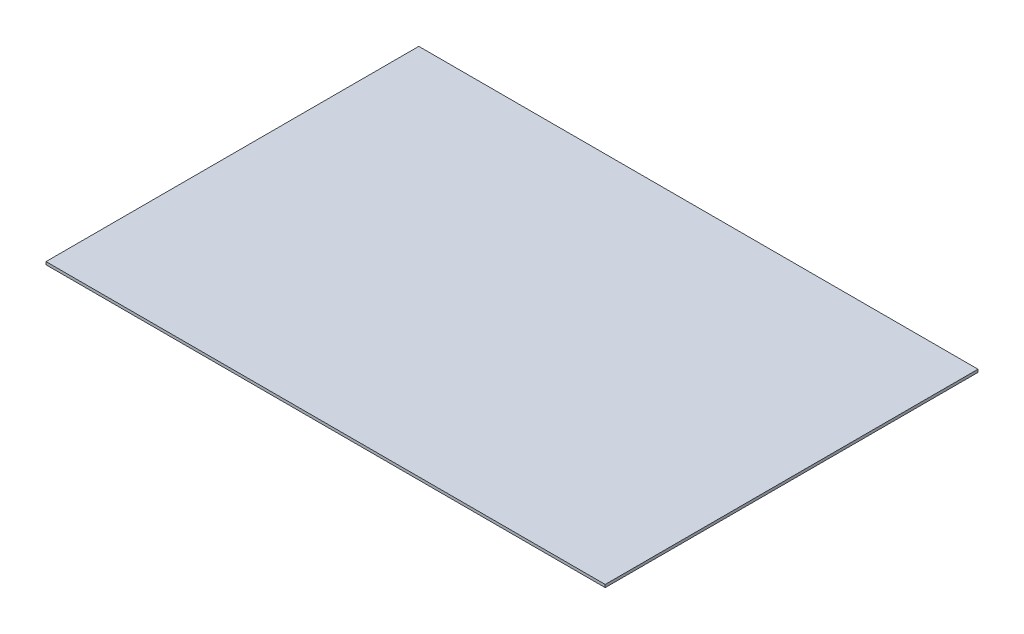
ISO-10303-21;
HEADER;
FILE_DESCRIPTION(('STEP AP214'),'2;1');
FILE_NAME('part.step','',(''),(''),'','','');
FILE_SCHEMA(('AUTOMOTIVE_DESIGN { 1 0 10303 214 1 1 1 1 }'));
ENDSEC;
DATA;
#1=APPLICATION_CONTEXT('core data for automotive mechanical design processes');
#2=APPLICATION_PROTOCOL_DEFINITION('international standard','automotive_design',2000,#1);
#3=PRODUCT_CONTEXT('',#1,'mechanical');
#4=PRODUCT('Part','Part','',(#3));
#5=PRODUCT_RELATED_PRODUCT_CATEGORY('part','',(#4));
#6=PRODUCT_DEFINITION_FORMATION('','',#4);
#7=PRODUCT_DEFINITION_CONTEXT('part definition',#1,'design');
#8=PRODUCT_DEFINITION('design','',#6,#7);
#9=PRODUCT_DEFINITION_SHAPE('','',#8);
#10=(LENGTH_UNIT() NAMED_UNIT(*) SI_UNIT(.MILLI.,.METRE.));
#11=(NAMED_UNIT(*) PLANE_ANGLE_UNIT() SI_UNIT($,.RADIAN.));
#12=(NAMED_UNIT(*) SI_UNIT($,.STERADIAN.) SOLID_ANGLE_UNIT());
#13=UNCERTAINTY_MEASURE_WITH_UNIT(LENGTH_MEASURE(1.E-05),#10,'distance_accuracy_value','');
#14=(GEOMETRIC_REPRESENTATION_CONTEXT(3) GLOBAL_UNCERTAINTY_ASSIGNED_CONTEXT((#13)) GLOBAL_UNIT_ASSIGNED_CONTEXT((#10,
#11,#12)) REPRESENTATION_CONTEXT('',''));
#15=CARTESIAN_POINT('',(0.,0.,0.));
#16=DIRECTION('',(0.,0.,1.));
#17=DIRECTION('',(1.,0.,0.));
#18=AXIS2_PLACEMENT_3D('',#15,#16,#17);
#19=CARTESIAN_POINT('',(0.,1.5,0.));
#20=DIRECTION('',(1.,0.,0.));
#21=DIRECTION('',(0.,0.,-1.));
#22=AXIS2_PLACEMENT_3D('',#19,#20,#21);
#23=PLANE('',#22);
#24=DIRECTION('',(0.,0.,1.));
#25=VECTOR('',#24,1.);
#26=CARTESIAN_POINT('',(0.,0.,0.));
#27=LINE('',#26,#25);
#28=CARTESIAN_POINT('',(0.,0.,-200.));
#29=VERTEX_POINT('',#28);
#30=CARTESIAN_POINT('',(0.,0.,0.));
#31=VERTEX_POINT('',#30);
#32=EDGE_CURVE('E96',#29,#31,#27,.T.);
#33=ORIENTED_EDGE('',*,*,#32,.T.);
#34=DIRECTION('',(0.,-1.,0.));
#35=VECTOR('',#34,1.);
#36=CARTESIAN_POINT('',(0.,1.5,0.));
#37=LINE('',#36,#35);
#38=CARTESIAN_POINT('',(0.,1.5,0.));
#39=VERTEX_POINT('',#38);
#40=EDGE_CURVE('E11',#39,#31,#37,.T.);
#41=ORIENTED_EDGE('',*,*,#40,.F.);
#42=DIRECTION('',(0.,0.,1.));
#43=VECTOR('',#42,1.);
#44=CARTESIAN_POINT('',(0.,1.5,0.));
#45=LINE('',#44,#43);
#46=CARTESIAN_POINT('',(0.,1.5,-200.));
#47=VERTEX_POINT('',#46);
#48=EDGE_CURVE('E84',#47,#39,#45,.T.);
#49=ORIENTED_EDGE('',*,*,#48,.F.);
#50=DIRECTION('',(0.,-1.,0.));
#51=VECTOR('',#50,1.);
#52=CARTESIAN_POINT('',(0.,1.5,-200.));
#53=LINE('',#52,#51);
#54=EDGE_CURVE('E92',#47,#29,#53,.T.);
#55=ORIENTED_EDGE('',*,*,#54,.T.);
#56=EDGE_LOOP('',(#33,#41,#49,#55));
#57=FACE_BOUND('',#56,.T.);
#58=ADVANCED_FACE('F33',(#57),#23,.F.);
#59=CARTESIAN_POINT('',(0.,1.5,0.));
#60=DIRECTION('',(0.,0.,-1.));
#61=DIRECTION('',(-1.,0.,0.));
#62=AXIS2_PLACEMENT_3D('',#59,#60,#61);
#63=PLANE('',#62);
#64=DIRECTION('',(1.,0.,0.));
#65=VECTOR('',#64,1.);
#66=CARTESIAN_POINT('',(0.,0.,0.));
#67=LINE('',#66,#65);
#68=CARTESIAN_POINT('',(300.,0.,0.));
#69=VERTEX_POINT('',#68);
#70=EDGE_CURVE('E88',#31,#69,#67,.T.);
#71=ORIENTED_EDGE('',*,*,#70,.T.);
#72=DIRECTION('',(0.,-1.,0.));
#73=VECTOR('',#72,1.);
#74=CARTESIAN_POINT('',(300.,1.5,0.));
#75=LINE('',#74,#73);
#76=CARTESIAN_POINT('',(300.,1.5,0.));
#77=VERTEX_POINT('',#76);
#78=EDGE_CURVE('E41',#77,#69,#75,.T.);
#79=ORIENTED_EDGE('',*,*,#78,.F.);
#80=DIRECTION('',(1.,0.,0.));
#81=VECTOR('',#80,1.);
#82=CARTESIAN_POINT('',(0.,1.5,0.));
#83=LINE('',#82,#81);
#84=EDGE_CURVE('E79',#39,#77,#83,.T.);
#85=ORIENTED_EDGE('',*,*,#84,.F.);
#86=ORIENTED_EDGE('',*,*,#40,.T.);
#87=EDGE_LOOP('',(#71,#79,#85,#86));
#88=FACE_BOUND('',#87,.T.);
#89=ADVANCED_FACE('F87',(#88),#63,.F.);
#90=CARTESIAN_POINT('',(300.,1.5,0.));
#91=DIRECTION('',(-1.,0.,0.));
#92=DIRECTION('',(0.,0.,1.));
#93=AXIS2_PLACEMENT_3D('',#90,#91,#92);
#94=PLANE('',#93);
#95=DIRECTION('',(0.,0.,-1.));
#96=VECTOR('',#95,1.);
#97=CARTESIAN_POINT('',(300.,0.,0.));
#98=LINE('',#97,#96);
#99=CARTESIAN_POINT('',(300.,0.,-200.));
#100=VERTEX_POINT('',#99);
#101=EDGE_CURVE('E66',#69,#100,#98,.T.);
#102=ORIENTED_EDGE('',*,*,#101,.T.);
#103=DIRECTION('',(0.,-1.,0.));
#104=VECTOR('',#103,1.);
#105=CARTESIAN_POINT('',(300.,1.5,-200.));
#106=LINE('',#105,#104);
#107=CARTESIAN_POINT('',(300.,1.5,-200.));
#108=VERTEX_POINT('',#107);
#109=EDGE_CURVE('E89',#108,#100,#106,.T.);
#110=ORIENTED_EDGE('',*,*,#109,.F.);
#111=DIRECTION('',(0.,0.,-1.));
#112=VECTOR('',#111,1.);
#113=CARTESIAN_POINT('',(300.,1.5,0.));
#114=LINE('',#113,#112);
#115=EDGE_CURVE('E82',#77,#108,#114,.T.);
#116=ORIENTED_EDGE('',*,*,#115,.F.);
#117=ORIENTED_EDGE('',*,*,#78,.T.);
#118=EDGE_LOOP('',(#102,#110,#116,#117));
#119=FACE_BOUND('',#118,.T.);
#120=ADVANCED_FACE('F90',(#119),#94,.F.);
#121=CARTESIAN_POINT('',(0.,1.5,-200.));
#122=DIRECTION('',(0.,0.,1.));
#123=DIRECTION('',(1.,0.,0.));
#124=AXIS2_PLACEMENT_3D('',#121,#122,#123);
#125=PLANE('',#124);
#126=DIRECTION('',(-1.,0.,0.));
#127=VECTOR('',#126,1.);
#128=CARTESIAN_POINT('',(0.,0.,-200.));
#129=LINE('',#128,#127);
#130=EDGE_CURVE('E72',#100,#29,#129,.T.);
#131=ORIENTED_EDGE('',*,*,#130,.T.);
#132=ORIENTED_EDGE('',*,*,#54,.F.);
#133=DIRECTION('',(-1.,0.,0.));
#134=VECTOR('',#133,1.);
#135=CARTESIAN_POINT('',(0.,1.5,-200.));
#136=LINE('',#135,#134);
#137=EDGE_CURVE('E49',#108,#47,#136,.T.);
#138=ORIENTED_EDGE('',*,*,#137,.F.);
#139=ORIENTED_EDGE('',*,*,#109,.T.);
#140=EDGE_LOOP('',(#131,#132,#138,#139));
#141=FACE_BOUND('',#140,.T.);
#142=ADVANCED_FACE('F103',(#141),#125,.F.);
#143=CARTESIAN_POINT('',(0.,1.5,0.));
#144=DIRECTION('',(0.,-1.,0.));
#145=DIRECTION('',(0.,0.,-1.));
#146=AXIS2_PLACEMENT_3D('',#143,#144,#145);
#147=PLANE('',#146);
#148=ORIENTED_EDGE('',*,*,#48,.T.);
#149=ORIENTED_EDGE('',*,*,#84,.T.);
#150=ORIENTED_EDGE('',*,*,#115,.T.);
#151=ORIENTED_EDGE('',*,*,#137,.T.);
#152=EDGE_LOOP('',(#148,#149,#150,#151));
#153=FACE_BOUND('',#152,.T.);
#154=ADVANCED_FACE('F80',(#153),#147,.F.);
#155=CARTESIAN_POINT('',(0.,0.,0.));
#156=DIRECTION('',(0.,-1.,0.));
#157=DIRECTION('',(0.,0.,-1.));
#158=AXIS2_PLACEMENT_3D('',#155,#156,#157);
#159=PLANE('',#158);
#160=ORIENTED_EDGE('',*,*,#32,.F.);
#161=ORIENTED_EDGE('',*,*,#130,.F.);
#162=ORIENTED_EDGE('',*,*,#101,.F.);
#163=ORIENTED_EDGE('',*,*,#70,.F.);
#164=EDGE_LOOP('',(#160,#161,#162,#163));
#165=FACE_BOUND('',#164,.T.);
#166=ADVANCED_FACE('F106',(#165),#159,.T.);
#167=CLOSED_SHELL('',(#58,#89,#120,#142,#154,#166));
#168=MANIFOLD_SOLID_BREP('B2',#167);
#169=ADVANCED_BREP_SHAPE_REPRESENTATION('',(#18,#168),#14);
#170=SHAPE_DEFINITION_REPRESENTATION(#9,#169);
ENDSEC;
END-ISO-10303-21;
